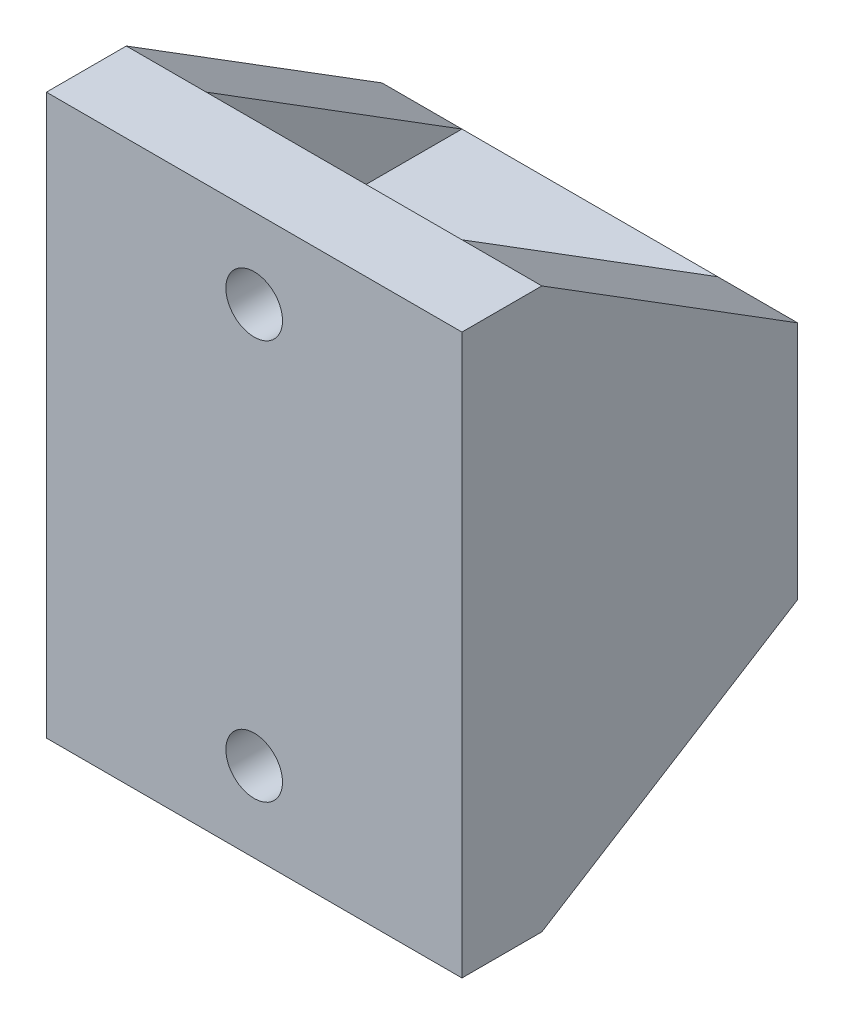
ISO-10303-21;
HEADER;
FILE_DESCRIPTION(('STEP AP214'),'2;1');
FILE_NAME('part.step','',(''),(''),'','','');
FILE_SCHEMA(('AUTOMOTIVE_DESIGN { 1 0 10303 214 1 1 1 1 }'));
ENDSEC;
DATA;
#1=APPLICATION_CONTEXT('core data for automotive mechanical design processes');
#2=APPLICATION_PROTOCOL_DEFINITION('international standard','automotive_design',2000,#1);
#3=PRODUCT_CONTEXT('',#1,'mechanical');
#4=PRODUCT('Part','Part','',(#3));
#5=PRODUCT_RELATED_PRODUCT_CATEGORY('part','',(#4));
#6=PRODUCT_DEFINITION_FORMATION('','',#4);
#7=PRODUCT_DEFINITION_CONTEXT('part definition',#1,'design');
#8=PRODUCT_DEFINITION('design','',#6,#7);
#9=PRODUCT_DEFINITION_SHAPE('','',#8);
#10=(LENGTH_UNIT() NAMED_UNIT(*) SI_UNIT(.MILLI.,.METRE.));
#11=(NAMED_UNIT(*) PLANE_ANGLE_UNIT() SI_UNIT($,.RADIAN.));
#12=(NAMED_UNIT(*) SI_UNIT($,.STERADIAN.) SOLID_ANGLE_UNIT());
#13=UNCERTAINTY_MEASURE_WITH_UNIT(LENGTH_MEASURE(1.E-05),#10,'distance_accuracy_value','');
#14=(GEOMETRIC_REPRESENTATION_CONTEXT(3) GLOBAL_UNCERTAINTY_ASSIGNED_CONTEXT((#13)) GLOBAL_UNIT_ASSIGNED_CONTEXT((#10,
#11,#12)) REPRESENTATION_CONTEXT('',''));
#15=CARTESIAN_POINT('',(0.,0.,0.));
#16=DIRECTION('',(0.,0.,1.));
#17=DIRECTION('',(1.,0.,0.));
#18=AXIS2_PLACEMENT_3D('',#15,#16,#17);
#19=CARTESIAN_POINT('',(-16.51,9.525,20.32));
#20=DIRECTION('',(0.,-1.,0.));
#21=DIRECTION('',(0.,0.,-1.));
#22=AXIS2_PLACEMENT_3D('',#19,#20,#21);
#23=PLANE('',#22);
#24=CARTESIAN_POINT('',(0.,9.525,10.287));
#25=DIRECTION('',(0.,1.,0.));
#26=DIRECTION('',(0.,0.,1.));
#27=AXIS2_PLACEMENT_3D('',#24,#25,#26);
#28=CIRCLE('',#27,2.4765);
#29=CARTESIAN_POINT('',(0.,9.525,12.7635));
#30=VERTEX_POINT('',#29);
#31=EDGE_CURVE('E225',#30,#30,#28,.T.);
#32=ORIENTED_EDGE('',*,*,#31,.F.);
#33=EDGE_LOOP('',(#32));
#34=FACE_BOUND('',#33,.T.);
#35=DIRECTION('',(0.,0.,-1.));
#36=VECTOR('',#35,1.);
#37=CARTESIAN_POINT('',(-10.16,9.525,0.));
#38=LINE('',#37,#36);
#39=CARTESIAN_POINT('',(-10.16,9.525,20.32));
#40=VERTEX_POINT('',#39);
#41=CARTESIAN_POINT('',(-10.16,9.525,0.));
#42=VERTEX_POINT('',#41);
#43=EDGE_CURVE('E179',#40,#42,#38,.T.);
#44=ORIENTED_EDGE('',*,*,#43,.F.);
#45=DIRECTION('',(-1.,0.,0.));
#46=VECTOR('',#45,1.);
#47=CARTESIAN_POINT('',(-16.51,9.525,20.32));
#48=LINE('',#47,#46);
#49=CARTESIAN_POINT('',(10.16,9.525,20.32));
#50=VERTEX_POINT('',#49);
#51=EDGE_CURVE('E45',#50,#40,#48,.T.);
#52=ORIENTED_EDGE('',*,*,#51,.F.);
#53=DIRECTION('',(0.,0.,-1.));
#54=VECTOR('',#53,1.);
#55=CARTESIAN_POINT('',(10.16,9.525,0.));
#56=LINE('',#55,#54);
#57=CARTESIAN_POINT('',(10.16,9.525,0.));
#58=VERTEX_POINT('',#57);
#59=EDGE_CURVE('E376',#50,#58,#56,.T.);
#60=ORIENTED_EDGE('',*,*,#59,.T.);
#61=DIRECTION('',(-1.,0.,0.));
#62=VECTOR('',#61,1.);
#63=CARTESIAN_POINT('',(-16.51,9.525,0.));
#64=LINE('',#63,#62);
#65=EDGE_CURVE('E305',#58,#42,#64,.T.);
#66=ORIENTED_EDGE('',*,*,#65,.T.);
#67=EDGE_LOOP('',(#44,#52,#60,#66));
#68=FACE_BOUND('',#67,.T.);
#69=ADVANCED_FACE('F36',(#34,#68),#23,.F.);
#70=CARTESIAN_POINT('',(0.,0.,20.32));
#71=DIRECTION('',(0.,0.,1.));
#72=DIRECTION('',(1.,0.,0.));
#73=AXIS2_PLACEMENT_3D('',#70,#71,#72);
#74=PLANE('',#73);
#75=CARTESIAN_POINT('',(0.,15.875,20.32));
#76=DIRECTION('',(0.,0.,-1.));
#77=DIRECTION('',(1.,0.,0.));
#78=AXIS2_PLACEMENT_3D('',#75,#76,#77);
#79=CIRCLE('',#78,2.25);
#80=CARTESIAN_POINT('',(2.25,15.875,20.32));
#81=VERTEX_POINT('',#80);
#82=EDGE_CURVE('E396',#81,#81,#79,.T.);
#83=ORIENTED_EDGE('',*,*,#82,.F.);
#84=EDGE_LOOP('',(#83));
#85=FACE_BOUND('',#84,.T.);
#86=DIRECTION('',(0.,-1.,0.));
#87=VECTOR('',#86,1.);
#88=CARTESIAN_POINT('',(-10.16,9.525,20.32));
#89=LINE('',#88,#87);
#90=CARTESIAN_POINT('',(-10.16,22.225,20.32));
#91=VERTEX_POINT('',#90);
#92=EDGE_CURVE('E177',#91,#40,#89,.T.);
#93=ORIENTED_EDGE('',*,*,#92,.F.);
#94=DIRECTION('',(-1.,0.,0.));
#95=VECTOR('',#94,1.);
#96=CARTESIAN_POINT('',(-16.51,22.225,20.32));
#97=LINE('',#96,#95);
#98=CARTESIAN_POINT('',(10.16,22.225,20.32));
#99=VERTEX_POINT('',#98);
#100=EDGE_CURVE('E199',#99,#91,#97,.T.);
#101=ORIENTED_EDGE('',*,*,#100,.F.);
#102=DIRECTION('',(0.,-1.,0.));
#103=VECTOR('',#102,1.);
#104=CARTESIAN_POINT('',(10.16,9.525,20.32));
#105=LINE('',#104,#103);
#106=EDGE_CURVE('E373',#99,#50,#105,.T.);
#107=ORIENTED_EDGE('',*,*,#106,.T.);
#108=ORIENTED_EDGE('',*,*,#51,.T.);
#109=EDGE_LOOP('',(#93,#101,#107,#108));
#110=FACE_BOUND('',#109,.T.);
#111=ADVANCED_FACE('F197',(#85,#110),#74,.F.);
#112=CARTESIAN_POINT('',(0.,0.,0.));
#113=DIRECTION('',(0.,0.,1.));
#114=DIRECTION('',(1.,0.,0.));
#115=AXIS2_PLACEMENT_3D('',#112,#113,#114);
#116=PLANE('',#115);
#117=DIRECTION('',(0.,1.,0.));
#118=VECTOR('',#117,1.);
#119=CARTESIAN_POINT('',(16.51,9.525,0.));
#120=LINE('',#119,#118);
#121=CARTESIAN_POINT('',(16.51,-9.525,0.));
#122=VERTEX_POINT('',#121);
#123=CARTESIAN_POINT('',(16.51,9.525,0.));
#124=VERTEX_POINT('',#123);
#125=EDGE_CURVE('E300',#122,#124,#120,.T.);
#126=ORIENTED_EDGE('',*,*,#125,.F.);
#127=DIRECTION('',(1.,0.,0.));
#128=VECTOR('',#127,1.);
#129=CARTESIAN_POINT('',(10.16,-9.525,0.));
#130=LINE('',#129,#128);
#131=CARTESIAN_POINT('',(10.16,-9.525,0.));
#132=VERTEX_POINT('',#131);
#133=EDGE_CURVE('E331',#132,#122,#130,.T.);
#134=ORIENTED_EDGE('',*,*,#133,.F.);
#135=DIRECTION('',(1.,0.,0.));
#136=VECTOR('',#135,1.);
#137=CARTESIAN_POINT('',(-16.51,-9.525,0.));
#138=LINE('',#137,#136);
#139=CARTESIAN_POINT('',(-10.16,-9.525,0.));
#140=VERTEX_POINT('',#139);
#141=EDGE_CURVE('E310',#140,#132,#138,.T.);
#142=ORIENTED_EDGE('',*,*,#141,.F.);
#143=CARTESIAN_POINT('',(-16.51,-9.525,0.));
#144=VERTEX_POINT('',#143);
#145=EDGE_CURVE('E301',#144,#140,#138,.T.);
#146=ORIENTED_EDGE('',*,*,#145,.F.);
#147=DIRECTION('',(0.,-1.,0.));
#148=VECTOR('',#147,1.);
#149=CARTESIAN_POINT('',(-16.51,9.525,0.));
#150=LINE('',#149,#148);
#151=CARTESIAN_POINT('',(-16.51,9.525,0.));
#152=VERTEX_POINT('',#151);
#153=EDGE_CURVE('E308',#152,#144,#150,.T.);
#154=ORIENTED_EDGE('',*,*,#153,.F.);
#155=DIRECTION('',(-1.,0.,0.));
#156=VECTOR('',#155,1.);
#157=CARTESIAN_POINT('',(-10.16,9.525,0.));
#158=LINE('',#157,#156);
#159=EDGE_CURVE('E192',#42,#152,#158,.T.);
#160=ORIENTED_EDGE('',*,*,#159,.F.);
#161=ORIENTED_EDGE('',*,*,#65,.F.);
#162=EDGE_CURVE('E306',#124,#58,#64,.T.);
#163=ORIENTED_EDGE('',*,*,#162,.F.);
#164=EDGE_LOOP('',(#126,#134,#142,#146,#154,#160,#161,#163));
#165=FACE_BOUND('',#164,.T.);
#166=DIRECTION('',(-1.,0.,0.));
#167=VECTOR('',#166,1.);
#168=CARTESIAN_POINT('',(-10.16,4.3815,0.));
#169=LINE('',#168,#167);
#170=CARTESIAN_POINT('',(-10.16,4.3815,0.));
#171=VERTEX_POINT('',#170);
#172=CARTESIAN_POINT('',(-13.716,4.3815,0.));
#173=VERTEX_POINT('',#172);
#174=EDGE_CURVE('E234',#171,#173,#169,.T.);
#175=ORIENTED_EDGE('',*,*,#174,.T.);
#176=DIRECTION('',(0.,-1.,0.));
#177=VECTOR('',#176,1.);
#178=CARTESIAN_POINT('',(-13.716,4.3815,0.));
#179=LINE('',#178,#177);
#180=CARTESIAN_POINT('',(-13.716,-4.3815,0.));
#181=VERTEX_POINT('',#180);
#182=EDGE_CURVE('E263',#173,#181,#179,.T.);
#183=ORIENTED_EDGE('',*,*,#182,.T.);
#184=DIRECTION('',(1.,0.,0.));
#185=VECTOR('',#184,1.);
#186=CARTESIAN_POINT('',(-13.716,-4.3815,0.));
#187=LINE('',#186,#185);
#188=CARTESIAN_POINT('',(13.716,-4.3815,0.));
#189=VERTEX_POINT('',#188);
#190=EDGE_CURVE('E266',#181,#189,#187,.T.);
#191=ORIENTED_EDGE('',*,*,#190,.T.);
#192=DIRECTION('',(0.,1.,0.));
#193=VECTOR('',#192,1.);
#194=CARTESIAN_POINT('',(13.716,-4.3815,0.));
#195=LINE('',#194,#193);
#196=CARTESIAN_POINT('',(13.716,4.3815,0.));
#197=VERTEX_POINT('',#196);
#198=EDGE_CURVE('E269',#189,#197,#195,.T.);
#199=ORIENTED_EDGE('',*,*,#198,.T.);
#200=DIRECTION('',(-1.,0.,0.));
#201=VECTOR('',#200,1.);
#202=CARTESIAN_POINT('',(13.716,4.3815,0.));
#203=LINE('',#202,#201);
#204=CARTESIAN_POINT('',(10.16,4.3815,0.));
#205=VERTEX_POINT('',#204);
#206=EDGE_CURVE('E272',#197,#205,#203,.T.);
#207=ORIENTED_EDGE('',*,*,#206,.T.);
#208=DIRECTION('',(0.,-1.,0.));
#209=VECTOR('',#208,1.);
#210=CARTESIAN_POINT('',(10.16,4.3815,0.));
#211=LINE('',#210,#209);
#212=CARTESIAN_POINT('',(10.16,-0.571499999999998,0.));
#213=VERTEX_POINT('',#212);
#214=EDGE_CURVE('E275',#205,#213,#211,.T.);
#215=ORIENTED_EDGE('',*,*,#214,.T.);
#216=DIRECTION('',(-1.,0.,0.));
#217=VECTOR('',#216,1.);
#218=CARTESIAN_POINT('',(10.16,-0.571499999999998,0.));
#219=LINE('',#218,#217);
#220=CARTESIAN_POINT('',(-10.16,-0.571500000000002,0.));
#221=VERTEX_POINT('',#220);
#222=EDGE_CURVE('E278',#213,#221,#219,.T.);
#223=ORIENTED_EDGE('',*,*,#222,.T.);
#224=DIRECTION('',(0.,1.,0.));
#225=VECTOR('',#224,1.);
#226=CARTESIAN_POINT('',(-10.16,-0.571500000000002,0.));
#227=LINE('',#226,#225);
#228=EDGE_CURVE('E239',#221,#171,#227,.T.);
#229=ORIENTED_EDGE('',*,*,#228,.T.);
#230=EDGE_LOOP('',(#175,#183,#191,#199,#207,#215,#223,#229));
#231=FACE_BOUND('',#230,.T.);
#232=ADVANCED_FACE('F343',(#165,#231),#116,.F.);
#233=CARTESIAN_POINT('',(16.51,9.525,20.32));
#234=DIRECTION('',(-1.,0.,0.));
#235=DIRECTION('',(0.,-1.,0.));
#236=AXIS2_PLACEMENT_3D('',#233,#234,#235);
#237=PLANE('',#236);
#238=ORIENTED_EDGE('',*,*,#125,.T.);
#239=DIRECTION('',(0.,0.52999894000318,0.847998304005088));
#240=VECTOR('',#239,1.);
#241=CARTESIAN_POINT('',(16.51,22.225,20.32));
#242=LINE('',#241,#240);
#243=CARTESIAN_POINT('',(16.51,22.225,20.32));
#244=VERTEX_POINT('',#243);
#245=EDGE_CURVE('E372',#124,#244,#242,.T.);
#246=ORIENTED_EDGE('',*,*,#245,.T.);
#247=DIRECTION('',(0.,0.,-1.));
#248=VECTOR('',#247,1.);
#249=CARTESIAN_POINT('',(16.51,22.225,26.67));
#250=LINE('',#249,#248);
#251=CARTESIAN_POINT('',(16.51,22.225,26.67));
#252=VERTEX_POINT('',#251);
#253=EDGE_CURVE('E216',#252,#244,#250,.T.);
#254=ORIENTED_EDGE('',*,*,#253,.F.);
#255=DIRECTION('',(0.,1.,0.));
#256=VECTOR('',#255,1.);
#257=CARTESIAN_POINT('',(16.51,22.225,26.67));
#258=LINE('',#257,#256);
#259=CARTESIAN_POINT('',(16.51,-22.225,26.67));
#260=VERTEX_POINT('',#259);
#261=EDGE_CURVE('E355',#260,#252,#258,.T.);
#262=ORIENTED_EDGE('',*,*,#261,.F.);
#263=DIRECTION('',(0.,0.,-1.));
#264=VECTOR('',#263,1.);
#265=CARTESIAN_POINT('',(16.51,-22.225,26.67));
#266=LINE('',#265,#264);
#267=CARTESIAN_POINT('',(16.51,-22.225,20.32));
#268=VERTEX_POINT('',#267);
#269=EDGE_CURVE('E219',#260,#268,#266,.T.);
#270=ORIENTED_EDGE('',*,*,#269,.T.);
#271=DIRECTION('',(0.,0.52999894000318,-0.847998304005088));
#272=VECTOR('',#271,1.);
#273=CARTESIAN_POINT('',(16.51,-22.225,20.32));
#274=LINE('',#273,#272);
#275=EDGE_CURVE('E349',#268,#122,#274,.T.);
#276=ORIENTED_EDGE('',*,*,#275,.T.);
#277=EDGE_LOOP('',(#238,#246,#254,#262,#270,#276));
#278=FACE_BOUND('',#277,.T.);
#279=ADVANCED_FACE('F38',(#278),#237,.F.);
#280=CARTESIAN_POINT('',(-16.51,9.525,20.32));
#281=DIRECTION('',(1.,0.,0.));
#282=DIRECTION('',(0.,1.,0.));
#283=AXIS2_PLACEMENT_3D('',#280,#281,#282);
#284=PLANE('',#283);
#285=ORIENTED_EDGE('',*,*,#153,.T.);
#286=DIRECTION('',(0.,0.52999894000318,-0.847998304005088));
#287=VECTOR('',#286,1.);
#288=CARTESIAN_POINT('',(-16.51,-22.225,20.32));
#289=LINE('',#288,#287);
#290=CARTESIAN_POINT('',(-16.51,-22.225,20.32));
#291=VERTEX_POINT('',#290);
#292=EDGE_CURVE('E365',#291,#144,#289,.T.);
#293=ORIENTED_EDGE('',*,*,#292,.F.);
#294=DIRECTION('',(0.,0.,-1.));
#295=VECTOR('',#294,1.);
#296=CARTESIAN_POINT('',(-16.51,-22.225,26.67));
#297=LINE('',#296,#295);
#298=CARTESIAN_POINT('',(-16.51,-22.225,26.67));
#299=VERTEX_POINT('',#298);
#300=EDGE_CURVE('E222',#299,#291,#297,.T.);
#301=ORIENTED_EDGE('',*,*,#300,.F.);
#302=DIRECTION('',(0.,-1.,0.));
#303=VECTOR('',#302,1.);
#304=CARTESIAN_POINT('',(-16.51,22.225,26.67));
#305=LINE('',#304,#303);
#306=CARTESIAN_POINT('',(-16.51,22.225,26.67));
#307=VERTEX_POINT('',#306);
#308=EDGE_CURVE('E208',#307,#299,#305,.T.);
#309=ORIENTED_EDGE('',*,*,#308,.F.);
#310=DIRECTION('',(0.,0.,-1.));
#311=VECTOR('',#310,1.);
#312=CARTESIAN_POINT('',(-16.51,22.225,26.67));
#313=LINE('',#312,#311);
#314=CARTESIAN_POINT('',(-16.51,22.225,20.32));
#315=VERTEX_POINT('',#314);
#316=EDGE_CURVE('E214',#307,#315,#313,.T.);
#317=ORIENTED_EDGE('',*,*,#316,.T.);
#318=DIRECTION('',(0.,0.52999894000318,0.847998304005088));
#319=VECTOR('',#318,1.);
#320=CARTESIAN_POINT('',(-16.51,22.225,20.32));
#321=LINE('',#320,#319);
#322=EDGE_CURVE('E187',#152,#315,#321,.T.);
#323=ORIENTED_EDGE('',*,*,#322,.F.);
#324=EDGE_LOOP('',(#285,#293,#301,#309,#317,#323));
#325=FACE_BOUND('',#324,.T.);
#326=ADVANCED_FACE('F364',(#325),#284,.F.);
#327=CARTESIAN_POINT('',(-16.51,-9.525,20.32));
#328=DIRECTION('',(0.,1.,0.));
#329=DIRECTION('',(0.,0.,1.));
#330=AXIS2_PLACEMENT_3D('',#327,#328,#329);
#331=PLANE('',#330);
#332=CARTESIAN_POINT('',(0.,-9.525,10.287));
#333=DIRECTION('',(0.,1.,0.));
#334=DIRECTION('',(0.,0.,1.));
#335=AXIS2_PLACEMENT_3D('',#332,#333,#334);
#336=CIRCLE('',#335,2.4765);
#337=CARTESIAN_POINT('',(0.,-9.525,12.7635));
#338=VERTEX_POINT('',#337);
#339=EDGE_CURVE('E226',#338,#338,#336,.T.);
#340=ORIENTED_EDGE('',*,*,#339,.T.);
#341=EDGE_LOOP('',(#340));
#342=FACE_BOUND('',#341,.T.);
#343=DIRECTION('',(1.,0.,0.));
#344=VECTOR('',#343,1.);
#345=CARTESIAN_POINT('',(-16.51,-9.525,20.32));
#346=LINE('',#345,#344);
#347=CARTESIAN_POINT('',(-10.16,-9.525,20.32));
#348=VERTEX_POINT('',#347);
#349=CARTESIAN_POINT('',(10.16,-9.525,20.32));
#350=VERTEX_POINT('',#349);
#351=EDGE_CURVE('E11',#348,#350,#346,.T.);
#352=ORIENTED_EDGE('',*,*,#351,.F.);
#353=DIRECTION('',(0.,0.,1.));
#354=VECTOR('',#353,1.);
#355=CARTESIAN_POINT('',(-10.16,-9.525,0.));
#356=LINE('',#355,#354);
#357=EDGE_CURVE('E323',#140,#348,#356,.T.);
#358=ORIENTED_EDGE('',*,*,#357,.F.);
#359=ORIENTED_EDGE('',*,*,#141,.T.);
#360=DIRECTION('',(0.,0.,1.));
#361=VECTOR('',#360,1.);
#362=CARTESIAN_POINT('',(10.16,-9.525,0.));
#363=LINE('',#362,#361);
#364=EDGE_CURVE('E322',#132,#350,#363,.T.);
#365=ORIENTED_EDGE('',*,*,#364,.T.);
#366=EDGE_LOOP('',(#352,#358,#359,#365));
#367=FACE_BOUND('',#366,.T.);
#368=ADVANCED_FACE('F320',(#342,#367),#331,.F.);
#369=CARTESIAN_POINT('',(-10.16,4.3815,20.32));
#370=DIRECTION('',(0.,-1.,0.));
#371=DIRECTION('',(1.,0.,0.));
#372=AXIS2_PLACEMENT_3D('',#369,#370,#371);
#373=PLANE('',#372);
#374=ORIENTED_EDGE('',*,*,#174,.F.);
#375=DIRECTION('',(0.,0.,-1.));
#376=VECTOR('',#375,1.);
#377=CARTESIAN_POINT('',(-10.16,4.3815,20.32));
#378=LINE('',#377,#376);
#379=CARTESIAN_POINT('',(-10.16,4.3815,20.32));
#380=VERTEX_POINT('',#379);
#381=EDGE_CURVE('E260',#380,#171,#378,.T.);
#382=ORIENTED_EDGE('',*,*,#381,.F.);
#383=DIRECTION('',(-1.,0.,0.));
#384=VECTOR('',#383,1.);
#385=CARTESIAN_POINT('',(-10.16,4.3815,20.32));
#386=LINE('',#385,#384);
#387=CARTESIAN_POINT('',(-13.716,4.3815,20.32));
#388=VERTEX_POINT('',#387);
#389=EDGE_CURVE('E235',#380,#388,#386,.T.);
#390=ORIENTED_EDGE('',*,*,#389,.T.);
#391=DIRECTION('',(0.,0.,-1.));
#392=VECTOR('',#391,1.);
#393=CARTESIAN_POINT('',(-13.716,4.3815,20.32));
#394=LINE('',#393,#392);
#395=EDGE_CURVE('E297',#388,#173,#394,.T.);
#396=ORIENTED_EDGE('',*,*,#395,.T.);
#397=EDGE_LOOP('',(#374,#382,#390,#396));
#398=FACE_BOUND('',#397,.T.);
#399=ADVANCED_FACE('F442',(#398),#373,.T.);
#400=CARTESIAN_POINT('',(-13.716,4.3815,20.32));
#401=DIRECTION('',(1.,0.,0.));
#402=DIRECTION('',(0.,1.,0.));
#403=AXIS2_PLACEMENT_3D('',#400,#401,#402);
#404=PLANE('',#403);
#405=ORIENTED_EDGE('',*,*,#182,.F.);
#406=ORIENTED_EDGE('',*,*,#395,.F.);
#407=DIRECTION('',(0.,-1.,0.));
#408=VECTOR('',#407,1.);
#409=CARTESIAN_POINT('',(-13.716,4.3815,20.32));
#410=LINE('',#409,#408);
#411=CARTESIAN_POINT('',(-13.716,-4.3815,20.32));
#412=VERTEX_POINT('',#411);
#413=EDGE_CURVE('E238',#388,#412,#410,.T.);
#414=ORIENTED_EDGE('',*,*,#413,.T.);
#415=DIRECTION('',(0.,0.,-1.));
#416=VECTOR('',#415,1.);
#417=CARTESIAN_POINT('',(-13.716,-4.3815,20.32));
#418=LINE('',#417,#416);
#419=EDGE_CURVE('E295',#412,#181,#418,.T.);
#420=ORIENTED_EDGE('',*,*,#419,.T.);
#421=EDGE_LOOP('',(#405,#406,#414,#420));
#422=FACE_BOUND('',#421,.T.);
#423=ADVANCED_FACE('F448',(#422),#404,.T.);
#424=CARTESIAN_POINT('',(-13.716,-4.3815,20.32));
#425=DIRECTION('',(0.,1.,0.));
#426=DIRECTION('',(0.,0.,1.));
#427=AXIS2_PLACEMENT_3D('',#424,#425,#426);
#428=PLANE('',#427);
#429=CARTESIAN_POINT('',(0.,-4.3815,10.287));
#430=DIRECTION('',(0.,1.,0.));
#431=DIRECTION('',(0.,0.,1.));
#432=AXIS2_PLACEMENT_3D('',#429,#430,#431);
#433=CIRCLE('',#432,2.4765);
#434=CARTESIAN_POINT('',(0.,-4.3815,12.7635));
#435=VERTEX_POINT('',#434);
#436=EDGE_CURVE('E231',#435,#435,#433,.T.);
#437=ORIENTED_EDGE('',*,*,#436,.F.);
#438=EDGE_LOOP('',(#437));
#439=FACE_BOUND('',#438,.T.);
#440=ORIENTED_EDGE('',*,*,#190,.F.);
#441=ORIENTED_EDGE('',*,*,#419,.F.);
#442=DIRECTION('',(1.,0.,0.));
#443=VECTOR('',#442,1.);
#444=CARTESIAN_POINT('',(-13.716,-4.3815,20.32));
#445=LINE('',#444,#443);
#446=CARTESIAN_POINT('',(13.716,-4.3815,20.32));
#447=VERTEX_POINT('',#446);
#448=EDGE_CURVE('E242',#412,#447,#445,.T.);
#449=ORIENTED_EDGE('',*,*,#448,.T.);
#450=DIRECTION('',(0.,0.,-1.));
#451=VECTOR('',#450,1.);
#452=CARTESIAN_POINT('',(13.716,-4.3815,20.32));
#453=LINE('',#452,#451);
#454=EDGE_CURVE('E293',#447,#189,#453,.T.);
#455=ORIENTED_EDGE('',*,*,#454,.T.);
#456=EDGE_LOOP('',(#440,#441,#449,#455));
#457=FACE_BOUND('',#456,.T.);
#458=ADVANCED_FACE('F452',(#439,#457),#428,.T.);
#459=CARTESIAN_POINT('',(13.716,-4.3815,20.32));
#460=DIRECTION('',(-1.,0.,0.));
#461=DIRECTION('',(0.,0.,1.));
#462=AXIS2_PLACEMENT_3D('',#459,#460,#461);
#463=PLANE('',#462);
#464=ORIENTED_EDGE('',*,*,#198,.F.);
#465=ORIENTED_EDGE('',*,*,#454,.F.);
#466=DIRECTION('',(0.,1.,0.));
#467=VECTOR('',#466,1.);
#468=CARTESIAN_POINT('',(13.716,-4.3815,20.32));
#469=LINE('',#468,#467);
#470=CARTESIAN_POINT('',(13.716,4.3815,20.32));
#471=VERTEX_POINT('',#470);
#472=EDGE_CURVE('E245',#447,#471,#469,.T.);
#473=ORIENTED_EDGE('',*,*,#472,.T.);
#474=DIRECTION('',(0.,0.,-1.));
#475=VECTOR('',#474,1.);
#476=CARTESIAN_POINT('',(13.716,4.3815,20.32));
#477=LINE('',#476,#475);
#478=EDGE_CURVE('E291',#471,#197,#477,.T.);
#479=ORIENTED_EDGE('',*,*,#478,.T.);
#480=EDGE_LOOP('',(#464,#465,#473,#479));
#481=FACE_BOUND('',#480,.T.);
#482=ADVANCED_FACE('F456',(#481),#463,.T.);
#483=CARTESIAN_POINT('',(13.716,4.3815,20.32));
#484=DIRECTION('',(0.,-1.,0.));
#485=DIRECTION('',(0.,0.,-1.));
#486=AXIS2_PLACEMENT_3D('',#483,#484,#485);
#487=PLANE('',#486);
#488=ORIENTED_EDGE('',*,*,#206,.F.);
#489=ORIENTED_EDGE('',*,*,#478,.F.);
#490=DIRECTION('',(-1.,0.,0.));
#491=VECTOR('',#490,1.);
#492=CARTESIAN_POINT('',(13.716,4.3815,20.32));
#493=LINE('',#492,#491);
#494=CARTESIAN_POINT('',(10.16,4.3815,20.32));
#495=VERTEX_POINT('',#494);
#496=EDGE_CURVE('E248',#471,#495,#493,.T.);
#497=ORIENTED_EDGE('',*,*,#496,.T.);
#498=DIRECTION('',(0.,0.,-1.));
#499=VECTOR('',#498,1.);
#500=CARTESIAN_POINT('',(10.16,4.3815,20.32));
#501=LINE('',#500,#499);
#502=EDGE_CURVE('E289',#495,#205,#501,.T.);
#503=ORIENTED_EDGE('',*,*,#502,.T.);
#504=EDGE_LOOP('',(#488,#489,#497,#503));
#505=FACE_BOUND('',#504,.T.);
#506=ADVANCED_FACE('F460',(#505),#487,.T.);
#507=CARTESIAN_POINT('',(10.16,4.3815,20.32));
#508=DIRECTION('',(1.,0.,0.));
#509=DIRECTION('',(0.,0.,-1.));
#510=AXIS2_PLACEMENT_3D('',#507,#508,#509);
#511=PLANE('',#510);
#512=ORIENTED_EDGE('',*,*,#214,.F.);
#513=ORIENTED_EDGE('',*,*,#502,.F.);
#514=DIRECTION('',(0.,-1.,0.));
#515=VECTOR('',#514,1.);
#516=CARTESIAN_POINT('',(10.16,4.3815,20.32));
#517=LINE('',#516,#515);
#518=CARTESIAN_POINT('',(10.16,-0.571499999999998,20.32));
#519=VERTEX_POINT('',#518);
#520=EDGE_CURVE('E251',#495,#519,#517,.T.);
#521=ORIENTED_EDGE('',*,*,#520,.T.);
#522=DIRECTION('',(0.,0.,-1.));
#523=VECTOR('',#522,1.);
#524=CARTESIAN_POINT('',(10.16,-0.571499999999998,20.32));
#525=LINE('',#524,#523);
#526=EDGE_CURVE('E287',#519,#213,#525,.T.);
#527=ORIENTED_EDGE('',*,*,#526,.T.);
#528=EDGE_LOOP('',(#512,#513,#521,#527));
#529=FACE_BOUND('',#528,.T.);
#530=ADVANCED_FACE('F464',(#529),#511,.T.);
#531=CARTESIAN_POINT('',(10.16,-0.571499999999998,20.32));
#532=DIRECTION('',(0.,-1.,0.));
#533=DIRECTION('',(1.,0.,0.));
#534=AXIS2_PLACEMENT_3D('',#531,#532,#533);
#535=PLANE('',#534);
#536=CARTESIAN_POINT('',(0.,-0.571500000000001,10.287));
#537=DIRECTION('',(0.,-1.,0.));
#538=DIRECTION('',(1.,0.,0.));
#539=AXIS2_PLACEMENT_3D('',#536,#537,#538);
#540=CIRCLE('',#539,2.4765);
#541=CARTESIAN_POINT('',(0.,-0.571500000000001,12.7635));
#542=VERTEX_POINT('',#541);
#543=EDGE_CURVE('E40',#542,#542,#540,.T.);
#544=ORIENTED_EDGE('',*,*,#543,.F.);
#545=EDGE_LOOP('',(#544));
#546=FACE_BOUND('',#545,.T.);
#547=ORIENTED_EDGE('',*,*,#222,.F.);
#548=ORIENTED_EDGE('',*,*,#526,.F.);
#549=DIRECTION('',(-1.,0.,0.));
#550=VECTOR('',#549,1.);
#551=CARTESIAN_POINT('',(10.16,-0.571499999999998,20.32));
#552=LINE('',#551,#550);
#553=CARTESIAN_POINT('',(-10.16,-0.571500000000002,20.32));
#554=VERTEX_POINT('',#553);
#555=EDGE_CURVE('E254',#519,#554,#552,.T.);
#556=ORIENTED_EDGE('',*,*,#555,.T.);
#557=DIRECTION('',(0.,0.,-1.));
#558=VECTOR('',#557,1.);
#559=CARTESIAN_POINT('',(-10.16,-0.571500000000002,20.32));
#560=LINE('',#559,#558);
#561=EDGE_CURVE('E285',#554,#221,#560,.T.);
#562=ORIENTED_EDGE('',*,*,#561,.T.);
#563=EDGE_LOOP('',(#547,#548,#556,#562));
#564=FACE_BOUND('',#563,.T.);
#565=ADVANCED_FACE('F468',(#546,#564),#535,.T.);
#566=CARTESIAN_POINT('',(-10.16,-0.571500000000002,20.32));
#567=DIRECTION('',(-1.,0.,0.));
#568=DIRECTION('',(0.,-1.,0.));
#569=AXIS2_PLACEMENT_3D('',#566,#567,#568);
#570=PLANE('',#569);
#571=ORIENTED_EDGE('',*,*,#228,.F.);
#572=ORIENTED_EDGE('',*,*,#561,.F.);
#573=DIRECTION('',(0.,1.,0.));
#574=VECTOR('',#573,1.);
#575=CARTESIAN_POINT('',(-10.16,-0.571500000000002,20.32));
#576=LINE('',#575,#574);
#577=EDGE_CURVE('E257',#554,#380,#576,.T.);
#578=ORIENTED_EDGE('',*,*,#577,.T.);
#579=ORIENTED_EDGE('',*,*,#381,.T.);
#580=EDGE_LOOP('',(#571,#572,#578,#579));
#581=FACE_BOUND('',#580,.T.);
#582=ADVANCED_FACE('F472',(#581),#570,.T.);
#583=CARTESIAN_POINT('',(0.,-9.525,10.287));
#584=DIRECTION('',(0.,1.,0.));
#585=DIRECTION('',(0.,0.,1.));
#586=AXIS2_PLACEMENT_3D('',#583,#584,#585);
#587=CYLINDRICAL_SURFACE('',#586,2.4765);
#588=CARTESIAN_POINT('',(0.,-0.571500000000001,12.7635));
#589=CARTESIAN_POINT('',(0.,-0.466328125000001,12.7635));
#590=CARTESIAN_POINT('',(0.,-0.361156250000001,12.7635));
#591=CARTESIAN_POINT('',(0.,-0.1508125,12.7635));
#592=CARTESIAN_POINT('',(0.,-0.0456406250000004,12.7635));
#593=CARTESIAN_POINT('',(0.,0.164703125,12.7635));
#594=CARTESIAN_POINT('',(0.,0.269875,12.7635));
#595=CARTESIAN_POINT('',(0.,0.48021875,12.7635));
#596=CARTESIAN_POINT('',(0.,0.585390625,12.7635));
#597=CARTESIAN_POINT('',(0.,0.795734375,12.7635));
#598=CARTESIAN_POINT('',(0.,0.90090625,12.7635));
#599=CARTESIAN_POINT('',(0.,1.11125,12.7635));
#600=CARTESIAN_POINT('',(0.,1.216421875,12.7635));
#601=CARTESIAN_POINT('',(0.,1.426765625,12.7635));
#602=CARTESIAN_POINT('',(0.,1.5319375,12.7635));
#603=CARTESIAN_POINT('',(0.,1.74228125,12.7635));
#604=CARTESIAN_POINT('',(0.,1.847453125,12.7635));
#605=CARTESIAN_POINT('',(0.,2.057796875,12.7635));
#606=CARTESIAN_POINT('',(0.,2.16296875,12.7635));
#607=CARTESIAN_POINT('',(0.,2.3733125,12.7635));
#608=CARTESIAN_POINT('',(0.,2.478484375,12.7635));
#609=CARTESIAN_POINT('',(0.,2.688828125,12.7635));
#610=CARTESIAN_POINT('',(0.,2.794,12.7635));
#611=CARTESIAN_POINT('',(0.,3.00434375,12.7635));
#612=CARTESIAN_POINT('',(0.,3.109515625,12.7635));
#613=CARTESIAN_POINT('',(0.,3.319859375,12.7635));
#614=CARTESIAN_POINT('',(0.,3.42503125,12.7635));
#615=CARTESIAN_POINT('',(0.,3.635375,12.7635));
#616=CARTESIAN_POINT('',(0.,3.740546875,12.7635));
#617=CARTESIAN_POINT('',(0.,3.950890625,12.7635));
#618=CARTESIAN_POINT('',(0.,4.0560625,12.7635));
#619=CARTESIAN_POINT('',(0.,4.26640625,12.7635));
#620=CARTESIAN_POINT('',(0.,4.371578125,12.7635));
#621=CARTESIAN_POINT('',(0.,4.581921875,12.7635));
#622=CARTESIAN_POINT('',(0.,4.68709375,12.7635));
#623=CARTESIAN_POINT('',(0.,4.8974375,12.7635));
#624=CARTESIAN_POINT('',(0.,5.002609375,12.7635));
#625=CARTESIAN_POINT('',(0.,5.212953125,12.7635));
#626=CARTESIAN_POINT('',(0.,5.318125,12.7635));
#627=CARTESIAN_POINT('',(0.,5.52846875,12.7635));
#628=CARTESIAN_POINT('',(0.,5.633640625,12.7635));
#629=CARTESIAN_POINT('',(0.,5.843984375,12.7635));
#630=CARTESIAN_POINT('',(0.,5.94915625,12.7635));
#631=CARTESIAN_POINT('',(0.,6.1595,12.7635));
#632=CARTESIAN_POINT('',(0.,6.264671875,12.7635));
#633=CARTESIAN_POINT('',(0.,6.475015625,12.7635));
#634=CARTESIAN_POINT('',(0.,6.5801875,12.7635));
#635=CARTESIAN_POINT('',(0.,6.79053125,12.7635));
#636=CARTESIAN_POINT('',(0.,6.895703125,12.7635));
#637=CARTESIAN_POINT('',(0.,7.106046875,12.7635));
#638=CARTESIAN_POINT('',(0.,7.21121875,12.7635));
#639=CARTESIAN_POINT('',(0.,7.4215625,12.7635));
#640=CARTESIAN_POINT('',(0.,7.526734375,12.7635));
#641=CARTESIAN_POINT('',(0.,7.737078125,12.7635));
#642=CARTESIAN_POINT('',(0.,7.84225,12.7635));
#643=CARTESIAN_POINT('',(0.,8.05259375,12.7635));
#644=CARTESIAN_POINT('',(0.,8.157765625,12.7635));
#645=CARTESIAN_POINT('',(0.,8.368109375,12.7635));
#646=CARTESIAN_POINT('',(0.,8.47328125,12.7635));
#647=CARTESIAN_POINT('',(0.,8.683625,12.7635));
#648=CARTESIAN_POINT('',(0.,8.788796875,12.7635));
#649=CARTESIAN_POINT('',(0.,8.999140625,12.7635));
#650=CARTESIAN_POINT('',(0.,9.1043125,12.7635));
#651=CARTESIAN_POINT('',(0.,9.31465625,12.7635));
#652=CARTESIAN_POINT('',(0.,9.419828125,12.7635));
#653=CARTESIAN_POINT('',(0.,9.525,12.7635));
#654=B_SPLINE_CURVE_WITH_KNOTS('',3,(#588,#589,#590,#591,#592,#593,#594,#595,#596,#597,#598,
#599,#600,#601,#602,#603,#604,#605,#606,#607,#608,#609,#610,#611,#612,#613,#614,#615,#616,#617,
#618,#619,#620,#621,#622,#623,#624,#625,#626,#627,#628,#629,#630,#631,#632,#633,#634,#635,#636,
#637,#638,#639,#640,#641,#642,#643,#644,#645,#646,#647,#648,#649,#650,#651,#652,#653),
.UNSPECIFIED.,.F.,.F.,(4,2,2,2,2,2,2,2,2,2,2,2,2,2,2,2,2,2,2,2,2,2,2,2,2,2,2,2,2,2,2,2,4),(0.,
0.315515625,0.63103125,0.946546875000001,1.2620625,1.577578125,1.89309375,2.208609375,2.524125,
2.839640625,3.15515625,3.470671875,3.7861875,4.101703125,4.41721875,4.732734375,5.04825,
5.363765625,5.67928125,5.994796875,6.3103125,6.625828125,6.94134375,7.256859375,7.572375,
7.887890625,8.20340625,8.518921875,8.8344375,9.149953125,9.46546875,9.780984375,10.0965),.UNSPECIFIED.);
#655=EDGE_CURVE('BSEAM476',#542,#30,#654,.T.);
#656=ORIENTED_EDGE('',*,*,#543,.T.);
#657=ORIENTED_EDGE('',*,*,#31,.T.);
#658=ORIENTED_EDGE('',*,*,#655,.T.);
#659=ORIENTED_EDGE('',*,*,#655,.F.);
#660=EDGE_LOOP('',(#656,#658,#657,#659));
#661=FACE_BOUND('',#660,.T.);
#662=ADVANCED_FACE('F476',(#661),#587,.F.);
#663=CARTESIAN_POINT('',(0.,-4.3815,12.7635));
#664=CARTESIAN_POINT('',(0.,-4.435078125,12.7635));
#665=CARTESIAN_POINT('',(0.,-4.48865625,12.7635));
#666=CARTESIAN_POINT('',(0.,-4.5958125,12.7635));
#667=CARTESIAN_POINT('',(0.,-4.649390625,12.7635));
#668=CARTESIAN_POINT('',(0.,-4.756546875,12.7635));
#669=CARTESIAN_POINT('',(0.,-4.810125,12.7635));
#670=CARTESIAN_POINT('',(0.,-4.91728125,12.7635));
#671=CARTESIAN_POINT('',(0.,-4.970859375,12.7635));
#672=CARTESIAN_POINT('',(0.,-5.078015625,12.7635));
#673=CARTESIAN_POINT('',(0.,-5.13159375,12.7635));
#674=CARTESIAN_POINT('',(0.,-5.23875,12.7635));
#675=CARTESIAN_POINT('',(0.,-5.292328125,12.7635));
#676=CARTESIAN_POINT('',(0.,-5.399484375,12.7635));
#677=CARTESIAN_POINT('',(0.,-5.4530625,12.7635));
#678=CARTESIAN_POINT('',(0.,-5.56021875,12.7635));
#679=CARTESIAN_POINT('',(0.,-5.613796875,12.7635));
#680=CARTESIAN_POINT('',(0.,-5.720953125,12.7635));
#681=CARTESIAN_POINT('',(0.,-5.77453125,12.7635));
#682=CARTESIAN_POINT('',(0.,-5.8816875,12.7635));
#683=CARTESIAN_POINT('',(0.,-5.935265625,12.7635));
#684=CARTESIAN_POINT('',(0.,-6.042421875,12.7635));
#685=CARTESIAN_POINT('',(0.,-6.096,12.7635));
#686=CARTESIAN_POINT('',(0.,-6.20315625,12.7635));
#687=CARTESIAN_POINT('',(0.,-6.256734375,12.7635));
#688=CARTESIAN_POINT('',(0.,-6.363890625,12.7635));
#689=CARTESIAN_POINT('',(0.,-6.41746875,12.7635));
#690=CARTESIAN_POINT('',(0.,-6.524625,12.7635));
#691=CARTESIAN_POINT('',(0.,-6.578203125,12.7635));
#692=CARTESIAN_POINT('',(0.,-6.685359375,12.7635));
#693=CARTESIAN_POINT('',(0.,-6.7389375,12.7635));
#694=CARTESIAN_POINT('',(0.,-6.84609375,12.7635));
#695=CARTESIAN_POINT('',(0.,-6.899671875,12.7635));
#696=CARTESIAN_POINT('',(0.,-7.006828125,12.7635));
#697=CARTESIAN_POINT('',(0.,-7.06040625,12.7635));
#698=CARTESIAN_POINT('',(0.,-7.1675625,12.7635));
#699=CARTESIAN_POINT('',(0.,-7.221140625,12.7635));
#700=CARTESIAN_POINT('',(0.,-7.328296875,12.7635));
#701=CARTESIAN_POINT('',(0.,-7.381875,12.7635));
#702=CARTESIAN_POINT('',(0.,-7.48903125,12.7635));
#703=CARTESIAN_POINT('',(0.,-7.542609375,12.7635));
#704=CARTESIAN_POINT('',(0.,-7.649765625,12.7635));
#705=CARTESIAN_POINT('',(0.,-7.70334375,12.7635));
#706=CARTESIAN_POINT('',(0.,-7.8105,12.7635));
#707=CARTESIAN_POINT('',(0.,-7.864078125,12.7635));
#708=CARTESIAN_POINT('',(0.,-7.971234375,12.7635));
#709=CARTESIAN_POINT('',(0.,-8.0248125,12.7635));
#710=CARTESIAN_POINT('',(0.,-8.13196875,12.7635));
#711=CARTESIAN_POINT('',(0.,-8.185546875,12.7635));
#712=CARTESIAN_POINT('',(0.,-8.292703125,12.7635));
#713=CARTESIAN_POINT('',(0.,-8.34628125,12.7635));
#714=CARTESIAN_POINT('',(0.,-8.4534375,12.7635));
#715=CARTESIAN_POINT('',(0.,-8.507015625,12.7635));
#716=CARTESIAN_POINT('',(0.,-8.614171875,12.7635));
#717=CARTESIAN_POINT('',(0.,-8.66775,12.7635));
#718=CARTESIAN_POINT('',(0.,-8.77490625,12.7635));
#719=CARTESIAN_POINT('',(0.,-8.828484375,12.7635));
#720=CARTESIAN_POINT('',(0.,-8.935640625,12.7635));
#721=CARTESIAN_POINT('',(0.,-8.98921875,12.7635));
#722=CARTESIAN_POINT('',(0.,-9.096375,12.7635));
#723=CARTESIAN_POINT('',(0.,-9.149953125,12.7635));
#724=CARTESIAN_POINT('',(0.,-9.257109375,12.7635));
#725=CARTESIAN_POINT('',(0.,-9.3106875,12.7635));
#726=CARTESIAN_POINT('',(0.,-9.41784375,12.7635));
#727=CARTESIAN_POINT('',(0.,-9.471421875,12.7635));
#728=CARTESIAN_POINT('',(0.,-9.525,12.7635));
#729=B_SPLINE_CURVE_WITH_KNOTS('',3,(#663,#664,#665,#666,#667,#668,#669,#670,#671,#672,#673,
#674,#675,#676,#677,#678,#679,#680,#681,#682,#683,#684,#685,#686,#687,#688,#689,#690,#691,#692,
#693,#694,#695,#696,#697,#698,#699,#700,#701,#702,#703,#704,#705,#706,#707,#708,#709,#710,#711,
#712,#713,#714,#715,#716,#717,#718,#719,#720,#721,#722,#723,#724,#725,#726,#727,#728),
.UNSPECIFIED.,.F.,.F.,(4,2,2,2,2,2,2,2,2,2,2,2,2,2,2,2,2,2,2,2,2,2,2,2,2,2,2,2,2,2,2,2,4),(0.,
0.160734375,0.32146875,0.482203125,0.6429375,0.803671875,0.96440625,1.125140625,1.285875,
1.446609375,1.60734375,1.768078125,1.9288125,2.089546875,2.25028125,2.411015625,2.57175,
2.732484375,2.89321875,3.053953125,3.2146875,3.375421875,3.53615625,3.696890625,3.857625,
4.018359375,4.17909375,4.339828125,4.5005625,4.661296875,4.82203125,4.982765625,5.1435),.UNSPECIFIED.);
#730=EDGE_CURVE('BSEAM426',#435,#338,#729,.T.);
#731=ORIENTED_EDGE('',*,*,#436,.T.);
#732=ORIENTED_EDGE('',*,*,#339,.F.);
#733=ORIENTED_EDGE('',*,*,#730,.T.);
#734=ORIENTED_EDGE('',*,*,#730,.F.);
#735=EDGE_LOOP('',(#731,#733,#732,#734));
#736=FACE_BOUND('',#735,.T.);
#737=ADVANCED_FACE('F426',(#736),#587,.F.);
#738=ORIENTED_EDGE('',*,*,#413,.F.);
#739=ORIENTED_EDGE('',*,*,#389,.F.);
#740=ORIENTED_EDGE('',*,*,#577,.F.);
#741=ORIENTED_EDGE('',*,*,#555,.F.);
#742=ORIENTED_EDGE('',*,*,#520,.F.);
#743=ORIENTED_EDGE('',*,*,#496,.F.);
#744=ORIENTED_EDGE('',*,*,#472,.F.);
#745=ORIENTED_EDGE('',*,*,#448,.F.);
#746=EDGE_LOOP('',(#738,#739,#740,#741,#742,#743,#744,#745));
#747=FACE_BOUND('',#746,.T.);
#748=ADVANCED_FACE('F419',(#747),#74,.F.);
#749=CARTESIAN_POINT('',(0.,-15.875,20.32));
#750=DIRECTION('',(0.,0.,-1.));
#751=DIRECTION('',(-1.,0.,0.));
#752=AXIS2_PLACEMENT_3D('',#749,#750,#751);
#753=CIRCLE('',#752,2.25);
#754=CARTESIAN_POINT('',(-2.25,-15.875,20.32));
#755=VERTEX_POINT('',#754);
#756=EDGE_CURVE('E402',#755,#755,#753,.T.);
#757=ORIENTED_EDGE('',*,*,#756,.F.);
#758=EDGE_LOOP('',(#757));
#759=FACE_BOUND('',#758,.T.);
#760=DIRECTION('',(1.,0.,0.));
#761=VECTOR('',#760,1.);
#762=CARTESIAN_POINT('',(-16.51,-22.225,20.32));
#763=LINE('',#762,#761);
#764=CARTESIAN_POINT('',(-10.16,-22.225,20.32));
#765=VERTEX_POINT('',#764);
#766=CARTESIAN_POINT('',(10.16,-22.225,20.32));
#767=VERTEX_POINT('',#766);
#768=EDGE_CURVE('E210',#765,#767,#763,.T.);
#769=ORIENTED_EDGE('',*,*,#768,.F.);
#770=DIRECTION('',(0.,-1.,0.));
#771=VECTOR('',#770,1.);
#772=CARTESIAN_POINT('',(-10.16,-9.525,20.32));
#773=LINE('',#772,#771);
#774=EDGE_CURVE('E53',#348,#765,#773,.T.);
#775=ORIENTED_EDGE('',*,*,#774,.F.);
#776=ORIENTED_EDGE('',*,*,#351,.T.);
#777=DIRECTION('',(0.,-1.,0.));
#778=VECTOR('',#777,1.);
#779=CARTESIAN_POINT('',(10.16,-9.525,20.32));
#780=LINE('',#779,#778);
#781=EDGE_CURVE('E338',#350,#767,#780,.T.);
#782=ORIENTED_EDGE('',*,*,#781,.T.);
#783=EDGE_LOOP('',(#769,#775,#776,#782));
#784=FACE_BOUND('',#783,.T.);
#785=ADVANCED_FACE('F417',(#759,#784),#74,.F.);
#786=CARTESIAN_POINT('',(-16.51,-22.225,26.67));
#787=DIRECTION('',(0.,1.,0.));
#788=DIRECTION('',(0.,0.,1.));
#789=AXIS2_PLACEMENT_3D('',#786,#787,#788);
#790=PLANE('',#789);
#791=EDGE_CURVE('E206',#291,#765,#763,.T.);
#792=ORIENTED_EDGE('',*,*,#791,.T.);
#793=ORIENTED_EDGE('',*,*,#768,.T.);
#794=DIRECTION('',(1.,0.,0.));
#795=VECTOR('',#794,1.);
#796=CARTESIAN_POINT('',(10.16,-22.225,20.32));
#797=LINE('',#796,#795);
#798=EDGE_CURVE('E334',#767,#268,#797,.T.);
#799=ORIENTED_EDGE('',*,*,#798,.T.);
#800=ORIENTED_EDGE('',*,*,#269,.F.);
#801=DIRECTION('',(1.,0.,0.));
#802=VECTOR('',#801,1.);
#803=CARTESIAN_POINT('',(-16.51,-22.225,26.67));
#804=LINE('',#803,#802);
#805=EDGE_CURVE('E353',#299,#260,#804,.T.);
#806=ORIENTED_EDGE('',*,*,#805,.F.);
#807=ORIENTED_EDGE('',*,*,#300,.T.);
#808=EDGE_LOOP('',(#792,#793,#799,#800,#806,#807));
#809=FACE_BOUND('',#808,.T.);
#810=ADVANCED_FACE('F368',(#809),#790,.F.);
#811=CARTESIAN_POINT('',(-16.51,22.225,26.67));
#812=DIRECTION('',(0.,-1.,0.));
#813=DIRECTION('',(0.,0.,-1.));
#814=AXIS2_PLACEMENT_3D('',#811,#812,#813);
#815=PLANE('',#814);
#816=EDGE_CURVE('E205',#244,#99,#97,.T.);
#817=ORIENTED_EDGE('',*,*,#816,.T.);
#818=ORIENTED_EDGE('',*,*,#100,.T.);
#819=DIRECTION('',(-1.,0.,0.));
#820=VECTOR('',#819,1.);
#821=CARTESIAN_POINT('',(-10.16,22.225,20.32));
#822=LINE('',#821,#820);
#823=EDGE_CURVE('E184',#91,#315,#822,.T.);
#824=ORIENTED_EDGE('',*,*,#823,.T.);
#825=ORIENTED_EDGE('',*,*,#316,.F.);
#826=DIRECTION('',(-1.,0.,0.));
#827=VECTOR('',#826,1.);
#828=CARTESIAN_POINT('',(-16.51,22.225,26.67));
#829=LINE('',#828,#827);
#830=EDGE_CURVE('E217',#252,#307,#829,.T.);
#831=ORIENTED_EDGE('',*,*,#830,.F.);
#832=ORIENTED_EDGE('',*,*,#253,.T.);
#833=EDGE_LOOP('',(#817,#818,#824,#825,#831,#832));
#834=FACE_BOUND('',#833,.T.);
#835=ADVANCED_FACE('F203',(#834),#815,.F.);
#836=CARTESIAN_POINT('',(0.,0.,26.67));
#837=DIRECTION('',(0.,0.,1.));
#838=DIRECTION('',(1.,0.,0.));
#839=AXIS2_PLACEMENT_3D('',#836,#837,#838);
#840=PLANE('',#839);
#841=CARTESIAN_POINT('',(0.,-15.875,26.67));
#842=DIRECTION('',(0.,0.,-1.));
#843=DIRECTION('',(-1.,0.,0.));
#844=AXIS2_PLACEMENT_3D('',#841,#842,#843);
#845=CIRCLE('',#844,2.25);
#846=CARTESIAN_POINT('',(-2.25,-15.875,26.67));
#847=VERTEX_POINT('',#846);
#848=EDGE_CURVE('E394',#847,#847,#845,.T.);
#849=ORIENTED_EDGE('',*,*,#848,.T.);
#850=EDGE_LOOP('',(#849));
#851=FACE_BOUND('',#850,.T.);
#852=CARTESIAN_POINT('',(0.,15.875,26.67));
#853=DIRECTION('',(0.,0.,-1.));
#854=DIRECTION('',(1.,0.,0.));
#855=AXIS2_PLACEMENT_3D('',#852,#853,#854);
#856=CIRCLE('',#855,2.25);
#857=CARTESIAN_POINT('',(2.25,15.875,26.67));
#858=VERTEX_POINT('',#857);
#859=EDGE_CURVE('E399',#858,#858,#856,.T.);
#860=ORIENTED_EDGE('',*,*,#859,.T.);
#861=EDGE_LOOP('',(#860));
#862=FACE_BOUND('',#861,.T.);
#863=ORIENTED_EDGE('',*,*,#308,.T.);
#864=ORIENTED_EDGE('',*,*,#805,.T.);
#865=ORIENTED_EDGE('',*,*,#261,.T.);
#866=ORIENTED_EDGE('',*,*,#830,.T.);
#867=EDGE_LOOP('',(#863,#864,#865,#866));
#868=FACE_BOUND('',#867,.T.);
#869=ADVANCED_FACE('F358',(#851,#862,#868),#840,.T.);
#870=CARTESIAN_POINT('',(10.16,-22.225,20.32));
#871=DIRECTION('',(0.,-0.847998304005088,-0.52999894000318));
#872=DIRECTION('',(0.,0.52999894000318,-0.847998304005088));
#873=AXIS2_PLACEMENT_3D('',#870,#871,#872);
#874=PLANE('',#873);
#875=ORIENTED_EDGE('',*,*,#275,.F.);
#876=ORIENTED_EDGE('',*,*,#798,.F.);
#877=DIRECTION('',(0.,0.52999894000318,-0.847998304005088));
#878=VECTOR('',#877,1.);
#879=CARTESIAN_POINT('',(10.16,-22.225,20.32));
#880=LINE('',#879,#878);
#881=EDGE_CURVE('E329',#767,#132,#880,.T.);
#882=ORIENTED_EDGE('',*,*,#881,.T.);
#883=ORIENTED_EDGE('',*,*,#133,.T.);
#884=EDGE_LOOP('',(#875,#876,#882,#883));
#885=FACE_BOUND('',#884,.T.);
#886=ADVANCED_FACE('F330',(#885),#874,.T.);
#887=CARTESIAN_POINT('',(10.16,0.,0.));
#888=DIRECTION('',(-1.,0.,0.));
#889=DIRECTION('',(0.,-1.,0.));
#890=AXIS2_PLACEMENT_3D('',#887,#888,#889);
#891=PLANE('',#890);
#892=ORIENTED_EDGE('',*,*,#781,.F.);
#893=ORIENTED_EDGE('',*,*,#364,.F.);
#894=ORIENTED_EDGE('',*,*,#881,.F.);
#895=EDGE_LOOP('',(#892,#893,#894));
#896=FACE_BOUND('',#895,.T.);
#897=ADVANCED_FACE('F340',(#896),#891,.T.);
#898=CARTESIAN_POINT('',(10.16,22.225,20.32));
#899=DIRECTION('',(0.,0.847998304005088,-0.52999894000318));
#900=DIRECTION('',(0.,0.52999894000318,0.847998304005088));
#901=AXIS2_PLACEMENT_3D('',#898,#899,#900);
#902=PLANE('',#901);
#903=ORIENTED_EDGE('',*,*,#245,.F.);
#904=ORIENTED_EDGE('',*,*,#162,.T.);
#905=DIRECTION('',(0.,0.52999894000318,0.847998304005088));
#906=VECTOR('',#905,1.);
#907=CARTESIAN_POINT('',(10.16,22.225,20.32));
#908=LINE('',#907,#906);
#909=EDGE_CURVE('E61',#58,#99,#908,.T.);
#910=ORIENTED_EDGE('',*,*,#909,.T.);
#911=ORIENTED_EDGE('',*,*,#816,.F.);
#912=EDGE_LOOP('',(#903,#904,#910,#911));
#913=FACE_BOUND('',#912,.T.);
#914=ADVANCED_FACE('F491',(#913),#902,.T.);
#915=CARTESIAN_POINT('',(10.16,0.,0.));
#916=DIRECTION('',(1.,0.,0.));
#917=DIRECTION('',(0.,1.,0.));
#918=AXIS2_PLACEMENT_3D('',#915,#916,#917);
#919=PLANE('',#918);
#920=ORIENTED_EDGE('',*,*,#106,.F.);
#921=ORIENTED_EDGE('',*,*,#909,.F.);
#922=ORIENTED_EDGE('',*,*,#59,.F.);
#923=EDGE_LOOP('',(#920,#921,#922));
#924=FACE_BOUND('',#923,.T.);
#925=ADVANCED_FACE('F494',(#924),#919,.F.);
#926=CARTESIAN_POINT('',(-10.16,-22.225,20.32));
#927=DIRECTION('',(0.,0.847998304005088,0.52999894000318));
#928=DIRECTION('',(0.,-0.52999894000318,0.847998304005088));
#929=AXIS2_PLACEMENT_3D('',#926,#927,#928);
#930=PLANE('',#929);
#931=ORIENTED_EDGE('',*,*,#292,.T.);
#932=ORIENTED_EDGE('',*,*,#145,.T.);
#933=DIRECTION('',(0.,0.52999894000318,-0.847998304005088));
#934=VECTOR('',#933,1.);
#935=CARTESIAN_POINT('',(-10.16,-22.225,20.32));
#936=LINE('',#935,#934);
#937=EDGE_CURVE('E374',#765,#140,#936,.T.);
#938=ORIENTED_EDGE('',*,*,#937,.F.);
#939=ORIENTED_EDGE('',*,*,#791,.F.);
#940=EDGE_LOOP('',(#931,#932,#938,#939));
#941=FACE_BOUND('',#940,.T.);
#942=ADVANCED_FACE('F497',(#941),#930,.F.);
#943=CARTESIAN_POINT('',(-10.16,0.,0.));
#944=DIRECTION('',(1.,0.,0.));
#945=DIRECTION('',(0.,-1.,0.));
#946=AXIS2_PLACEMENT_3D('',#943,#944,#945);
#947=PLANE('',#946);
#948=ORIENTED_EDGE('',*,*,#774,.T.);
#949=ORIENTED_EDGE('',*,*,#937,.T.);
#950=ORIENTED_EDGE('',*,*,#357,.T.);
#951=EDGE_LOOP('',(#948,#949,#950));
#952=FACE_BOUND('',#951,.T.);
#953=ADVANCED_FACE('F501',(#952),#947,.T.);
#954=CARTESIAN_POINT('',(-10.16,22.225,20.32));
#955=DIRECTION('',(0.,-0.847998304005088,0.52999894000318));
#956=DIRECTION('',(0.,-0.52999894000318,-0.847998304005088));
#957=AXIS2_PLACEMENT_3D('',#954,#955,#956);
#958=PLANE('',#957);
#959=ORIENTED_EDGE('',*,*,#322,.T.);
#960=ORIENTED_EDGE('',*,*,#823,.F.);
#961=DIRECTION('',(0.,0.52999894000318,0.847998304005088));
#962=VECTOR('',#961,1.);
#963=CARTESIAN_POINT('',(-10.16,22.225,20.32));
#964=LINE('',#963,#962);
#965=EDGE_CURVE('E173',#42,#91,#964,.T.);
#966=ORIENTED_EDGE('',*,*,#965,.F.);
#967=ORIENTED_EDGE('',*,*,#159,.T.);
#968=EDGE_LOOP('',(#959,#960,#966,#967));
#969=FACE_BOUND('',#968,.T.);
#970=ADVANCED_FACE('F185',(#969),#958,.F.);
#971=CARTESIAN_POINT('',(-10.16,0.,0.));
#972=DIRECTION('',(-1.,0.,0.));
#973=DIRECTION('',(0.,1.,0.));
#974=AXIS2_PLACEMENT_3D('',#971,#972,#973);
#975=PLANE('',#974);
#976=ORIENTED_EDGE('',*,*,#92,.T.);
#977=ORIENTED_EDGE('',*,*,#43,.T.);
#978=ORIENTED_EDGE('',*,*,#965,.T.);
#979=EDGE_LOOP('',(#976,#977,#978));
#980=FACE_BOUND('',#979,.T.);
#981=ADVANCED_FACE('F175',(#980),#975,.F.);
#982=CARTESIAN_POINT('',(0.,15.875,26.67));
#983=DIRECTION('',(0.,0.,-1.));
#984=DIRECTION('',(-1.,0.,0.));
#985=AXIS2_PLACEMENT_3D('',#982,#983,#984);
#986=CYLINDRICAL_SURFACE('',#985,2.25);
#987=ORIENTED_EDGE('',*,*,#859,.F.);
#988=EDGE_LOOP('',(#987));
#989=FACE_BOUND('',#988,.T.);
#990=ORIENTED_EDGE('',*,*,#82,.T.);
#991=EDGE_LOOP('',(#990));
#992=FACE_BOUND('',#991,.T.);
#993=ADVANCED_FACE('F413',(#989,#992),#986,.F.);
#994=CARTESIAN_POINT('',(0.,-15.875,26.67));
#995=DIRECTION('',(0.,0.,-1.));
#996=DIRECTION('',(-1.,0.,0.));
#997=AXIS2_PLACEMENT_3D('',#994,#995,#996);
#998=CYLINDRICAL_SURFACE('',#997,2.25);
#999=ORIENTED_EDGE('',*,*,#848,.F.);
#1000=EDGE_LOOP('',(#999));
#1001=FACE_BOUND('',#1000,.T.);
#1002=ORIENTED_EDGE('',*,*,#756,.T.);
#1003=EDGE_LOOP('',(#1002));
#1004=FACE_BOUND('',#1003,.T.);
#1005=ADVANCED_FACE('F410',(#1001,#1004),#998,.F.);
#1006=CLOSED_SHELL('',(#69,#111,#232,#279,#326,#368,#399,#423,#458,#482,#506,#530,#565,#582,
#662,#737,#748,#785,#810,#835,#869,#886,#897,#914,#925,#942,#953,#970,#981,#993,#1005));
#1007=MANIFOLD_SOLID_BREP('B2',#1006);
#1008=ADVANCED_BREP_SHAPE_REPRESENTATION('',(#18,#1007),#14);
#1009=SHAPE_DEFINITION_REPRESENTATION(#9,#1008);
ENDSEC;
END-ISO-10303-21;
